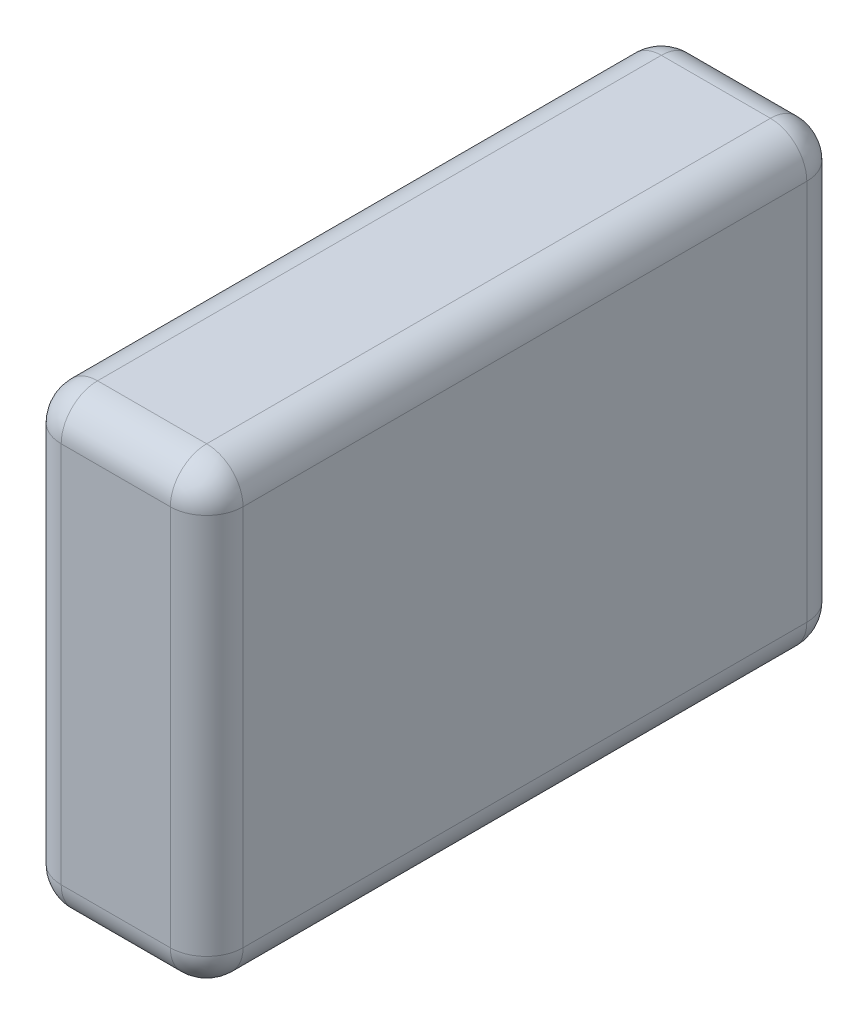
ISO-10303-21;
HEADER;
FILE_DESCRIPTION(('STEP AP214'),'2;1');
FILE_NAME('part.step','',(''),(''),'','','');
FILE_SCHEMA(('AUTOMOTIVE_DESIGN { 1 0 10303 214 1 1 1 1 }'));
ENDSEC;
DATA;
#1=APPLICATION_CONTEXT('core data for automotive mechanical design processes');
#2=APPLICATION_PROTOCOL_DEFINITION('international standard','automotive_design',2000,#1);
#3=PRODUCT_CONTEXT('',#1,'mechanical');
#4=PRODUCT('Part','Part','',(#3));
#5=PRODUCT_RELATED_PRODUCT_CATEGORY('part','',(#4));
#6=PRODUCT_DEFINITION_FORMATION('','',#4);
#7=PRODUCT_DEFINITION_CONTEXT('part definition',#1,'design');
#8=PRODUCT_DEFINITION('design','',#6,#7);
#9=PRODUCT_DEFINITION_SHAPE('','',#8);
#10=(LENGTH_UNIT() NAMED_UNIT(*) SI_UNIT(.MILLI.,.METRE.));
#11=(NAMED_UNIT(*) PLANE_ANGLE_UNIT() SI_UNIT($,.RADIAN.));
#12=(NAMED_UNIT(*) SI_UNIT($,.STERADIAN.) SOLID_ANGLE_UNIT());
#13=UNCERTAINTY_MEASURE_WITH_UNIT(LENGTH_MEASURE(1.E-05),#10,'distance_accuracy_value','');
#14=(GEOMETRIC_REPRESENTATION_CONTEXT(3) GLOBAL_UNCERTAINTY_ASSIGNED_CONTEXT((#13)) GLOBAL_UNIT_ASSIGNED_CONTEXT((#10,
#11,#12)) REPRESENTATION_CONTEXT('',''));
#15=CARTESIAN_POINT('',(0.,0.,0.));
#16=DIRECTION('',(0.,0.,1.));
#17=DIRECTION('',(1.,0.,0.));
#18=AXIS2_PLACEMENT_3D('',#15,#16,#17);
#19=CARTESIAN_POINT('',(20.,0.,0.));
#20=DIRECTION('',(0.,0.,-1.));
#21=DIRECTION('',(0.,1.,0.));
#22=AXIS2_PLACEMENT_3D('',#19,#20,#21);
#23=PLANE('',#22);
#24=DIRECTION('',(0.,-1.,0.));
#25=VECTOR('',#24,1.);
#26=CARTESIAN_POINT('',(16.,0.,0.));
#27=LINE('',#26,#25);
#28=CARTESIAN_POINT('',(16.,-46.,0.));
#29=VERTEX_POINT('',#28);
#30=CARTESIAN_POINT('',(16.,-4.,0.));
#31=VERTEX_POINT('',#30);
#32=EDGE_CURVE('E237',#29,#31,#27,.F.);
#33=ORIENTED_EDGE('',*,*,#32,.T.);
#34=DIRECTION('',(-1.,0.,0.));
#35=VECTOR('',#34,1.);
#36=CARTESIAN_POINT('',(20.,-4.,0.));
#37=LINE('',#36,#35);
#38=CARTESIAN_POINT('',(4.,-4.,0.));
#39=VERTEX_POINT('',#38);
#40=EDGE_CURVE('E183',#31,#39,#37,.T.);
#41=ORIENTED_EDGE('',*,*,#40,.T.);
#42=DIRECTION('',(0.,-1.,0.));
#43=VECTOR('',#42,1.);
#44=CARTESIAN_POINT('',(4.,0.,0.));
#45=LINE('',#44,#43);
#46=CARTESIAN_POINT('',(4.,-46.,0.));
#47=VERTEX_POINT('',#46);
#48=EDGE_CURVE('E291',#39,#47,#45,.T.);
#49=ORIENTED_EDGE('',*,*,#48,.T.);
#50=DIRECTION('',(-1.,0.,0.));
#51=VECTOR('',#50,1.);
#52=CARTESIAN_POINT('',(20.,-46.,0.));
#53=LINE('',#52,#51);
#54=EDGE_CURVE('E181',#47,#29,#53,.F.);
#55=ORIENTED_EDGE('',*,*,#54,.T.);
#56=EDGE_LOOP('',(#33,#41,#49,#55));
#57=FACE_BOUND('',#56,.T.);
#58=ADVANCED_FACE('F36',(#57),#23,.F.);
#59=CARTESIAN_POINT('',(20.,-50.,0.));
#60=DIRECTION('',(0.,1.,0.));
#61=DIRECTION('',(0.,0.,1.));
#62=AXIS2_PLACEMENT_3D('',#59,#60,#61);
#63=PLANE('',#62);
#64=DIRECTION('',(0.,0.,-1.));
#65=VECTOR('',#64,1.);
#66=CARTESIAN_POINT('',(16.,-50.,0.));
#67=LINE('',#66,#65);
#68=CARTESIAN_POINT('',(16.,-50.,-66.));
#69=VERTEX_POINT('',#68);
#70=CARTESIAN_POINT('',(16.,-50.,-4.00000000000001));
#71=VERTEX_POINT('',#70);
#72=EDGE_CURVE('E262',#69,#71,#67,.F.);
#73=ORIENTED_EDGE('',*,*,#72,.T.);
#74=DIRECTION('',(-1.,0.,0.));
#75=VECTOR('',#74,1.);
#76=CARTESIAN_POINT('',(20.,-50.,-4.00000000000001));
#77=LINE('',#76,#75);
#78=CARTESIAN_POINT('',(4.,-50.,-4.00000000000001));
#79=VERTEX_POINT('',#78);
#80=EDGE_CURVE('E11',#71,#79,#77,.T.);
#81=ORIENTED_EDGE('',*,*,#80,.T.);
#82=DIRECTION('',(0.,0.,-1.));
#83=VECTOR('',#82,1.);
#84=CARTESIAN_POINT('',(4.,-50.,0.));
#85=LINE('',#84,#83);
#86=CARTESIAN_POINT('',(4.,-50.,-66.));
#87=VERTEX_POINT('',#86);
#88=EDGE_CURVE('E130',#79,#87,#85,.T.);
#89=ORIENTED_EDGE('',*,*,#88,.T.);
#90=DIRECTION('',(-1.,0.,0.));
#91=VECTOR('',#90,1.);
#92=CARTESIAN_POINT('',(20.,-50.,-66.));
#93=LINE('',#92,#91);
#94=EDGE_CURVE('E45',#87,#69,#93,.F.);
#95=ORIENTED_EDGE('',*,*,#94,.T.);
#96=EDGE_LOOP('',(#73,#81,#89,#95));
#97=FACE_BOUND('',#96,.T.);
#98=ADVANCED_FACE('F334',(#97),#63,.F.);
#99=CARTESIAN_POINT('',(20.,0.,-70.));
#100=DIRECTION('',(0.,0.,1.));
#101=DIRECTION('',(1.,0.,0.));
#102=AXIS2_PLACEMENT_3D('',#99,#100,#101);
#103=PLANE('',#102);
#104=DIRECTION('',(0.,1.,0.));
#105=VECTOR('',#104,1.);
#106=CARTESIAN_POINT('',(4.,0.,-70.));
#107=LINE('',#106,#105);
#108=CARTESIAN_POINT('',(4.,-46.,-70.));
#109=VERTEX_POINT('',#108);
#110=CARTESIAN_POINT('',(4.,-4.,-70.));
#111=VERTEX_POINT('',#110);
#112=EDGE_CURVE('E155',#109,#111,#107,.T.);
#113=ORIENTED_EDGE('',*,*,#112,.T.);
#114=DIRECTION('',(-1.,0.,0.));
#115=VECTOR('',#114,1.);
#116=CARTESIAN_POINT('',(20.,-4.,-70.));
#117=LINE('',#116,#115);
#118=CARTESIAN_POINT('',(16.,-4.,-70.));
#119=VERTEX_POINT('',#118);
#120=EDGE_CURVE('E179',#111,#119,#117,.F.);
#121=ORIENTED_EDGE('',*,*,#120,.T.);
#122=DIRECTION('',(0.,1.,0.));
#123=VECTOR('',#122,1.);
#124=CARTESIAN_POINT('',(16.,-50.,-70.));
#125=LINE('',#124,#123);
#126=CARTESIAN_POINT('',(16.,-46.,-70.));
#127=VERTEX_POINT('',#126);
#128=EDGE_CURVE('E259',#119,#127,#125,.F.);
#129=ORIENTED_EDGE('',*,*,#128,.T.);
#130=DIRECTION('',(-1.,0.,0.));
#131=VECTOR('',#130,1.);
#132=CARTESIAN_POINT('',(20.,-46.,-70.));
#133=LINE('',#132,#131);
#134=EDGE_CURVE('E177',#127,#109,#133,.T.);
#135=ORIENTED_EDGE('',*,*,#134,.T.);
#136=EDGE_LOOP('',(#113,#121,#129,#135));
#137=FACE_BOUND('',#136,.T.);
#138=ADVANCED_FACE('F277',(#137),#103,.F.);
#139=CARTESIAN_POINT('',(20.,0.,0.));
#140=DIRECTION('',(0.,-1.,0.));
#141=DIRECTION('',(0.,0.,-1.));
#142=AXIS2_PLACEMENT_3D('',#139,#140,#141);
#143=PLANE('',#142);
#144=DIRECTION('',(0.,0.,1.));
#145=VECTOR('',#144,1.);
#146=CARTESIAN_POINT('',(16.,0.,-70.));
#147=LINE('',#146,#145);
#148=CARTESIAN_POINT('',(16.,0.,-4.));
#149=VERTEX_POINT('',#148);
#150=CARTESIAN_POINT('',(16.,0.,-66.));
#151=VERTEX_POINT('',#150);
#152=EDGE_CURVE('E264',#149,#151,#147,.F.);
#153=ORIENTED_EDGE('',*,*,#152,.T.);
#154=DIRECTION('',(-1.,0.,0.));
#155=VECTOR('',#154,1.);
#156=CARTESIAN_POINT('',(20.,0.,-66.));
#157=LINE('',#156,#155);
#158=CARTESIAN_POINT('',(4.,0.,-66.));
#159=VERTEX_POINT('',#158);
#160=EDGE_CURVE('E175',#151,#159,#157,.T.);
#161=ORIENTED_EDGE('',*,*,#160,.T.);
#162=DIRECTION('',(0.,0.,1.));
#163=VECTOR('',#162,1.);
#164=CARTESIAN_POINT('',(4.,0.,0.));
#165=LINE('',#164,#163);
#166=CARTESIAN_POINT('',(4.,0.,-4.));
#167=VERTEX_POINT('',#166);
#168=EDGE_CURVE('E292',#159,#167,#165,.T.);
#169=ORIENTED_EDGE('',*,*,#168,.T.);
#170=DIRECTION('',(-1.,0.,0.));
#171=VECTOR('',#170,1.);
#172=CARTESIAN_POINT('',(20.,0.,-4.));
#173=LINE('',#172,#171);
#174=EDGE_CURVE('E135',#167,#149,#173,.F.);
#175=ORIENTED_EDGE('',*,*,#174,.T.);
#176=EDGE_LOOP('',(#153,#161,#169,#175));
#177=FACE_BOUND('',#176,.T.);
#178=ADVANCED_FACE('F311',(#177),#143,.F.);
#179=CARTESIAN_POINT('',(20.,0.,0.));
#180=DIRECTION('',(1.,0.,0.));
#181=DIRECTION('',(0.,0.,-1.));
#182=AXIS2_PLACEMENT_3D('',#179,#180,#181);
#183=PLANE('',#182);
#184=DIRECTION('',(0.,-1.,0.));
#185=VECTOR('',#184,1.);
#186=CARTESIAN_POINT('',(20.,-50.,-4.00000000000001));
#187=LINE('',#186,#185);
#188=CARTESIAN_POINT('',(20.,-4.,-4.));
#189=VERTEX_POINT('',#188);
#190=CARTESIAN_POINT('',(20.,-46.,-4.00000000000001));
#191=VERTEX_POINT('',#190);
#192=EDGE_CURVE('E234',#189,#191,#187,.T.);
#193=ORIENTED_EDGE('',*,*,#192,.T.);
#194=DIRECTION('',(0.,0.,-1.));
#195=VECTOR('',#194,1.);
#196=CARTESIAN_POINT('',(20.,-46.,-70.));
#197=LINE('',#196,#195);
#198=CARTESIAN_POINT('',(20.,-46.,-66.));
#199=VERTEX_POINT('',#198);
#200=EDGE_CURVE('E242',#191,#199,#197,.T.);
#201=ORIENTED_EDGE('',*,*,#200,.T.);
#202=DIRECTION('',(0.,1.,0.));
#203=VECTOR('',#202,1.);
#204=CARTESIAN_POINT('',(20.,0.,-66.));
#205=LINE('',#204,#203);
#206=CARTESIAN_POINT('',(20.,-4.,-66.));
#207=VERTEX_POINT('',#206);
#208=EDGE_CURVE('E253',#199,#207,#205,.T.);
#209=ORIENTED_EDGE('',*,*,#208,.T.);
#210=DIRECTION('',(0.,0.,1.));
#211=VECTOR('',#210,1.);
#212=CARTESIAN_POINT('',(20.,-4.,0.));
#213=LINE('',#212,#211);
#214=EDGE_CURVE('E252',#207,#189,#213,.T.);
#215=ORIENTED_EDGE('',*,*,#214,.T.);
#216=EDGE_LOOP('',(#193,#201,#209,#215));
#217=FACE_BOUND('',#216,.T.);
#218=ADVANCED_FACE('F250',(#217),#183,.T.);
#219=CARTESIAN_POINT('',(0.,0.,0.));
#220=DIRECTION('',(1.,0.,0.));
#221=DIRECTION('',(0.,0.,-1.));
#222=AXIS2_PLACEMENT_3D('',#219,#220,#221);
#223=PLANE('',#222);
#224=DIRECTION('',(0.,0.,1.));
#225=VECTOR('',#224,1.);
#226=CARTESIAN_POINT('',(0.,-4.,0.));
#227=LINE('',#226,#225);
#228=CARTESIAN_POINT('',(0.,-4.,-4.));
#229=VERTEX_POINT('',#228);
#230=CARTESIAN_POINT('',(0.,-4.,-66.));
#231=VERTEX_POINT('',#230);
#232=EDGE_CURVE('E146',#229,#231,#227,.F.);
#233=ORIENTED_EDGE('',*,*,#232,.T.);
#234=DIRECTION('',(0.,1.,0.));
#235=VECTOR('',#234,1.);
#236=CARTESIAN_POINT('',(0.,0.,-66.));
#237=LINE('',#236,#235);
#238=CARTESIAN_POINT('',(0.,-46.,-66.));
#239=VERTEX_POINT('',#238);
#240=EDGE_CURVE('E145',#231,#239,#237,.F.);
#241=ORIENTED_EDGE('',*,*,#240,.T.);
#242=DIRECTION('',(0.,0.,-1.));
#243=VECTOR('',#242,1.);
#244=CARTESIAN_POINT('',(0.,-46.,0.));
#245=LINE('',#244,#243);
#246=CARTESIAN_POINT('',(0.,-46.,-4.00000000000001));
#247=VERTEX_POINT('',#246);
#248=EDGE_CURVE('E128',#239,#247,#245,.F.);
#249=ORIENTED_EDGE('',*,*,#248,.T.);
#250=DIRECTION('',(0.,-1.,0.));
#251=VECTOR('',#250,1.);
#252=CARTESIAN_POINT('',(0.,0.,-4.));
#253=LINE('',#252,#251);
#254=EDGE_CURVE('E142',#247,#229,#253,.F.);
#255=ORIENTED_EDGE('',*,*,#254,.T.);
#256=EDGE_LOOP('',(#233,#241,#249,#255));
#257=FACE_BOUND('',#256,.T.);
#258=ADVANCED_FACE('F141',(#257),#223,.F.);
#259=CARTESIAN_POINT('',(4.,0.,-4.));
#260=DIRECTION('',(0.,-1.,0.));
#261=DIRECTION('',(0.,0.,-1.));
#262=AXIS2_PLACEMENT_3D('',#259,#260,#261);
#263=CYLINDRICAL_SURFACE('',#262,4.);
#264=ORIENTED_EDGE('',*,*,#48,.F.);
#265=CARTESIAN_POINT('',(4.,-4.,-4.));
#266=DIRECTION('',(0.,-1.,0.));
#267=DIRECTION('',(0.,0.,-1.));
#268=AXIS2_PLACEMENT_3D('',#265,#266,#267);
#269=CIRCLE('',#268,4.);
#270=EDGE_CURVE('E154',#39,#229,#269,.T.);
#271=ORIENTED_EDGE('',*,*,#270,.T.);
#272=ORIENTED_EDGE('',*,*,#254,.F.);
#273=CARTESIAN_POINT('',(4.,-46.,-4.00000000000001));
#274=DIRECTION('',(0.,-1.,0.));
#275=DIRECTION('',(0.,0.,-1.));
#276=AXIS2_PLACEMENT_3D('',#273,#274,#275);
#277=CIRCLE('',#276,4.);
#278=EDGE_CURVE('E151',#247,#47,#277,.F.);
#279=ORIENTED_EDGE('',*,*,#278,.T.);
#280=EDGE_LOOP('',(#264,#271,#272,#279));
#281=FACE_BOUND('',#280,.T.);
#282=ADVANCED_FACE('F150',(#281),#263,.T.);
#283=CARTESIAN_POINT('',(4.,-46.,0.));
#284=DIRECTION('',(0.,0.,-1.));
#285=DIRECTION('',(-1.,0.,0.));
#286=AXIS2_PLACEMENT_3D('',#283,#284,#285);
#287=CYLINDRICAL_SURFACE('',#286,4.);
#288=ORIENTED_EDGE('',*,*,#88,.F.);
#289=CARTESIAN_POINT('',(4.,-46.,-4.00000000000001));
#290=DIRECTION('',(0.,0.,-1.));
#291=DIRECTION('',(-1.,0.,0.));
#292=AXIS2_PLACEMENT_3D('',#289,#290,#291);
#293=CIRCLE('',#292,4.);
#294=EDGE_CURVE('E125',#79,#247,#293,.T.);
#295=ORIENTED_EDGE('',*,*,#294,.T.);
#296=ORIENTED_EDGE('',*,*,#248,.F.);
#297=CARTESIAN_POINT('',(4.,-46.,-66.));
#298=DIRECTION('',(0.,0.,-1.));
#299=DIRECTION('',(-1.,0.,0.));
#300=AXIS2_PLACEMENT_3D('',#297,#298,#299);
#301=CIRCLE('',#300,4.);
#302=EDGE_CURVE('E53',#239,#87,#301,.F.);
#303=ORIENTED_EDGE('',*,*,#302,.T.);
#304=EDGE_LOOP('',(#288,#295,#296,#303));
#305=FACE_BOUND('',#304,.T.);
#306=ADVANCED_FACE('F127',(#305),#287,.T.);
#307=CARTESIAN_POINT('',(4.,-4.,0.));
#308=DIRECTION('',(0.,0.,1.));
#309=DIRECTION('',(1.,0.,0.));
#310=AXIS2_PLACEMENT_3D('',#307,#308,#309);
#311=CYLINDRICAL_SURFACE('',#310,4.);
#312=ORIENTED_EDGE('',*,*,#168,.F.);
#313=CARTESIAN_POINT('',(4.,-4.,-66.));
#314=DIRECTION('',(0.,0.,1.));
#315=DIRECTION('',(1.,0.,0.));
#316=AXIS2_PLACEMENT_3D('',#313,#314,#315);
#317=CIRCLE('',#316,4.);
#318=EDGE_CURVE('E225',#159,#231,#317,.T.);
#319=ORIENTED_EDGE('',*,*,#318,.T.);
#320=ORIENTED_EDGE('',*,*,#232,.F.);
#321=CARTESIAN_POINT('',(4.,-4.,-4.));
#322=DIRECTION('',(0.,0.,1.));
#323=DIRECTION('',(1.,0.,0.));
#324=AXIS2_PLACEMENT_3D('',#321,#322,#323);
#325=CIRCLE('',#324,4.);
#326=EDGE_CURVE('E218',#229,#167,#325,.F.);
#327=ORIENTED_EDGE('',*,*,#326,.T.);
#328=EDGE_LOOP('',(#312,#319,#320,#327));
#329=FACE_BOUND('',#328,.T.);
#330=ADVANCED_FACE('F308',(#329),#311,.T.);
#331=CARTESIAN_POINT('',(4.,0.,-66.));
#332=DIRECTION('',(0.,1.,0.));
#333=DIRECTION('',(0.,0.,1.));
#334=AXIS2_PLACEMENT_3D('',#331,#332,#333);
#335=CYLINDRICAL_SURFACE('',#334,4.);
#336=ORIENTED_EDGE('',*,*,#240,.F.);
#337=CARTESIAN_POINT('',(4.,-4.,-66.));
#338=DIRECTION('',(0.,1.,0.));
#339=DIRECTION('',(0.,0.,1.));
#340=AXIS2_PLACEMENT_3D('',#337,#338,#339);
#341=CIRCLE('',#340,4.);
#342=EDGE_CURVE('E215',#231,#111,#341,.F.);
#343=ORIENTED_EDGE('',*,*,#342,.T.);
#344=ORIENTED_EDGE('',*,*,#112,.F.);
#345=CARTESIAN_POINT('',(4.,-46.,-66.));
#346=DIRECTION('',(0.,1.,0.));
#347=DIRECTION('',(0.,0.,1.));
#348=AXIS2_PLACEMENT_3D('',#345,#346,#347);
#349=CIRCLE('',#348,4.);
#350=EDGE_CURVE('E212',#109,#239,#349,.T.);
#351=ORIENTED_EDGE('',*,*,#350,.T.);
#352=EDGE_LOOP('',(#336,#343,#344,#351));
#353=FACE_BOUND('',#352,.T.);
#354=ADVANCED_FACE('F303',(#353),#335,.T.);
#355=CARTESIAN_POINT('',(16.,0.,-66.));
#356=DIRECTION('',(0.,-1.,0.));
#357=DIRECTION('',(0.,0.,-1.));
#358=AXIS2_PLACEMENT_3D('',#355,#356,#357);
#359=CYLINDRICAL_SURFACE('',#358,4.);
#360=ORIENTED_EDGE('',*,*,#128,.F.);
#361=CARTESIAN_POINT('',(16.,-4.,-66.));
#362=DIRECTION('',(0.,-1.,0.));
#363=DIRECTION('',(0.,0.,-1.));
#364=AXIS2_PLACEMENT_3D('',#361,#362,#363);
#365=CIRCLE('',#364,4.);
#366=EDGE_CURVE('E216',#119,#207,#365,.T.);
#367=ORIENTED_EDGE('',*,*,#366,.T.);
#368=ORIENTED_EDGE('',*,*,#208,.F.);
#369=CARTESIAN_POINT('',(16.,-46.,-66.));
#370=DIRECTION('',(0.,-1.,0.));
#371=DIRECTION('',(0.,0.,-1.));
#372=AXIS2_PLACEMENT_3D('',#369,#370,#371);
#373=CIRCLE('',#372,4.);
#374=EDGE_CURVE('E220',#199,#127,#373,.F.);
#375=ORIENTED_EDGE('',*,*,#374,.T.);
#376=EDGE_LOOP('',(#360,#367,#368,#375));
#377=FACE_BOUND('',#376,.T.);
#378=ADVANCED_FACE('F273',(#377),#359,.T.);
#379=CARTESIAN_POINT('',(16.,-4.,0.));
#380=DIRECTION('',(0.,0.,-1.));
#381=DIRECTION('',(-1.,0.,0.));
#382=AXIS2_PLACEMENT_3D('',#379,#380,#381);
#383=CYLINDRICAL_SURFACE('',#382,4.);
#384=ORIENTED_EDGE('',*,*,#214,.F.);
#385=CARTESIAN_POINT('',(16.,-4.,-66.));
#386=DIRECTION('',(0.,0.,-1.));
#387=DIRECTION('',(-1.,0.,0.));
#388=AXIS2_PLACEMENT_3D('',#385,#386,#387);
#389=CIRCLE('',#388,4.);
#390=EDGE_CURVE('E269',#207,#151,#389,.F.);
#391=ORIENTED_EDGE('',*,*,#390,.T.);
#392=ORIENTED_EDGE('',*,*,#152,.F.);
#393=CARTESIAN_POINT('',(16.,-4.,-4.));
#394=DIRECTION('',(0.,0.,-1.));
#395=DIRECTION('',(-1.,0.,0.));
#396=AXIS2_PLACEMENT_3D('',#393,#394,#395);
#397=CIRCLE('',#396,4.);
#398=EDGE_CURVE('E267',#149,#189,#397,.T.);
#399=ORIENTED_EDGE('',*,*,#398,.T.);
#400=EDGE_LOOP('',(#384,#391,#392,#399));
#401=FACE_BOUND('',#400,.T.);
#402=ADVANCED_FACE('F288',(#401),#383,.T.);
#403=CARTESIAN_POINT('',(16.,-46.,0.));
#404=DIRECTION('',(0.,0.,1.));
#405=DIRECTION('',(1.,0.,0.));
#406=AXIS2_PLACEMENT_3D('',#403,#404,#405);
#407=CYLINDRICAL_SURFACE('',#406,4.);
#408=ORIENTED_EDGE('',*,*,#200,.F.);
#409=CARTESIAN_POINT('',(16.,-46.,-4.00000000000001));
#410=DIRECTION('',(0.,0.,1.));
#411=DIRECTION('',(1.,0.,0.));
#412=AXIS2_PLACEMENT_3D('',#409,#410,#411);
#413=CIRCLE('',#412,4.);
#414=EDGE_CURVE('E171',#191,#71,#413,.F.);
#415=ORIENTED_EDGE('',*,*,#414,.T.);
#416=ORIENTED_EDGE('',*,*,#72,.F.);
#417=CARTESIAN_POINT('',(16.,-46.,-66.));
#418=DIRECTION('',(0.,0.,1.));
#419=DIRECTION('',(1.,0.,0.));
#420=AXIS2_PLACEMENT_3D('',#417,#418,#419);
#421=CIRCLE('',#420,4.);
#422=EDGE_CURVE('E162',#69,#199,#421,.T.);
#423=ORIENTED_EDGE('',*,*,#422,.T.);
#424=EDGE_LOOP('',(#408,#415,#416,#423));
#425=FACE_BOUND('',#424,.T.);
#426=ADVANCED_FACE('F243',(#425),#407,.T.);
#427=CARTESIAN_POINT('',(16.,0.,-4.));
#428=DIRECTION('',(0.,1.,0.));
#429=DIRECTION('',(0.,0.,1.));
#430=AXIS2_PLACEMENT_3D('',#427,#428,#429);
#431=CYLINDRICAL_SURFACE('',#430,4.);
#432=ORIENTED_EDGE('',*,*,#192,.F.);
#433=CARTESIAN_POINT('',(16.,-4.,-4.));
#434=DIRECTION('',(0.,1.,0.));
#435=DIRECTION('',(0.,0.,1.));
#436=AXIS2_PLACEMENT_3D('',#433,#434,#435);
#437=CIRCLE('',#436,4.);
#438=EDGE_CURVE('E160',#189,#31,#437,.F.);
#439=ORIENTED_EDGE('',*,*,#438,.T.);
#440=ORIENTED_EDGE('',*,*,#32,.F.);
#441=CARTESIAN_POINT('',(16.,-46.,-4.00000000000001));
#442=DIRECTION('',(0.,1.,0.));
#443=DIRECTION('',(0.,0.,1.));
#444=AXIS2_PLACEMENT_3D('',#441,#442,#443);
#445=CIRCLE('',#444,4.);
#446=EDGE_CURVE('E165',#29,#191,#445,.T.);
#447=ORIENTED_EDGE('',*,*,#446,.T.);
#448=EDGE_LOOP('',(#432,#439,#440,#447));
#449=FACE_BOUND('',#448,.T.);
#450=ADVANCED_FACE('F232',(#449),#431,.T.);
#451=CARTESIAN_POINT('',(4.,-4.,-66.));
#452=DIRECTION('',(0.,0.,1.));
#453=DIRECTION('',(1.,0.,0.));
#454=AXIS2_PLACEMENT_3D('',#451,#452,#453);
#455=SPHERICAL_SURFACE('',#454,4.);
#456=ORIENTED_EDGE('',*,*,#342,.F.);
#457=ORIENTED_EDGE('',*,*,#318,.F.);
#458=CARTESIAN_POINT('',(4.,-4.,-66.));
#459=DIRECTION('',(1.,0.,0.));
#460=DIRECTION('',(0.,0.,-1.));
#461=AXIS2_PLACEMENT_3D('',#458,#459,#460);
#462=CIRCLE('',#461,4.);
#463=EDGE_CURVE('E188',#111,#159,#462,.T.);
#464=ORIENTED_EDGE('',*,*,#463,.F.);
#465=EDGE_LOOP('',(#456,#457,#464));
#466=FACE_BOUND('',#465,.T.);
#467=ADVANCED_FACE('F306',(#466),#455,.T.);
#468=CARTESIAN_POINT('',(20.,-4.,-66.));
#469=DIRECTION('',(-1.,0.,0.));
#470=DIRECTION('',(0.,0.,1.));
#471=AXIS2_PLACEMENT_3D('',#468,#469,#470);
#472=CYLINDRICAL_SURFACE('',#471,4.);
#473=ORIENTED_EDGE('',*,*,#463,.T.);
#474=ORIENTED_EDGE('',*,*,#160,.F.);
#475=CARTESIAN_POINT('',(16.,-4.,-66.));
#476=DIRECTION('',(1.,0.,0.));
#477=DIRECTION('',(0.,0.,-1.));
#478=AXIS2_PLACEMENT_3D('',#475,#476,#477);
#479=CIRCLE('',#478,4.);
#480=EDGE_CURVE('E186',#119,#151,#479,.T.);
#481=ORIENTED_EDGE('',*,*,#480,.F.);
#482=ORIENTED_EDGE('',*,*,#120,.F.);
#483=EDGE_LOOP('',(#473,#474,#481,#482));
#484=FACE_BOUND('',#483,.T.);
#485=ADVANCED_FACE('F282',(#484),#472,.T.);
#486=CARTESIAN_POINT('',(16.,-4.,-66.));
#487=DIRECTION('',(0.,0.,1.));
#488=DIRECTION('',(1.,0.,0.));
#489=AXIS2_PLACEMENT_3D('',#486,#487,#488);
#490=SPHERICAL_SURFACE('',#489,4.);
#491=ORIENTED_EDGE('',*,*,#390,.F.);
#492=ORIENTED_EDGE('',*,*,#366,.F.);
#493=ORIENTED_EDGE('',*,*,#480,.T.);
#494=EDGE_LOOP('',(#491,#492,#493));
#495=FACE_BOUND('',#494,.T.);
#496=ADVANCED_FACE('F286',(#495),#490,.T.);
#497=CARTESIAN_POINT('',(4.,-4.,-4.));
#498=DIRECTION('',(0.,0.,1.));
#499=DIRECTION('',(1.,0.,0.));
#500=AXIS2_PLACEMENT_3D('',#497,#498,#499);
#501=SPHERICAL_SURFACE('',#500,4.);
#502=ORIENTED_EDGE('',*,*,#326,.F.);
#503=ORIENTED_EDGE('',*,*,#270,.F.);
#504=CARTESIAN_POINT('',(4.,-4.,-4.));
#505=DIRECTION('',(1.,0.,0.));
#506=DIRECTION('',(0.,0.,-1.));
#507=AXIS2_PLACEMENT_3D('',#504,#505,#506);
#508=CIRCLE('',#507,4.);
#509=EDGE_CURVE('E189',#167,#39,#508,.T.);
#510=ORIENTED_EDGE('',*,*,#509,.F.);
#511=EDGE_LOOP('',(#502,#503,#510));
#512=FACE_BOUND('',#511,.T.);
#513=ADVANCED_FACE('F314',(#512),#501,.T.);
#514=CARTESIAN_POINT('',(20.,-4.,-4.));
#515=DIRECTION('',(-1.,0.,0.));
#516=DIRECTION('',(0.,0.,1.));
#517=AXIS2_PLACEMENT_3D('',#514,#515,#516);
#518=CYLINDRICAL_SURFACE('',#517,4.);
#519=ORIENTED_EDGE('',*,*,#509,.T.);
#520=ORIENTED_EDGE('',*,*,#40,.F.);
#521=CARTESIAN_POINT('',(16.,-4.,-4.));
#522=DIRECTION('',(1.,0.,0.));
#523=DIRECTION('',(0.,0.,-1.));
#524=AXIS2_PLACEMENT_3D('',#521,#522,#523);
#525=CIRCLE('',#524,4.);
#526=EDGE_CURVE('E192',#149,#31,#525,.T.);
#527=ORIENTED_EDGE('',*,*,#526,.F.);
#528=ORIENTED_EDGE('',*,*,#174,.F.);
#529=EDGE_LOOP('',(#519,#520,#527,#528));
#530=FACE_BOUND('',#529,.T.);
#531=ADVANCED_FACE('F318',(#530),#518,.T.);
#532=CARTESIAN_POINT('',(16.,-4.,-4.));
#533=DIRECTION('',(0.,0.,1.));
#534=DIRECTION('',(1.,0.,0.));
#535=AXIS2_PLACEMENT_3D('',#532,#533,#534);
#536=SPHERICAL_SURFACE('',#535,4.);
#537=ORIENTED_EDGE('',*,*,#438,.F.);
#538=ORIENTED_EDGE('',*,*,#398,.F.);
#539=ORIENTED_EDGE('',*,*,#526,.T.);
#540=EDGE_LOOP('',(#537,#538,#539));
#541=FACE_BOUND('',#540,.T.);
#542=ADVANCED_FACE('F320',(#541),#536,.T.);
#543=CARTESIAN_POINT('',(4.,-46.,-4.00000000000001));
#544=DIRECTION('',(0.,0.,1.));
#545=DIRECTION('',(1.,0.,0.));
#546=AXIS2_PLACEMENT_3D('',#543,#544,#545);
#547=SPHERICAL_SURFACE('',#546,4.);
#548=ORIENTED_EDGE('',*,*,#278,.F.);
#549=ORIENTED_EDGE('',*,*,#294,.F.);
#550=CARTESIAN_POINT('',(4.,-46.,-4.00000000000001));
#551=DIRECTION('',(1.,0.,0.));
#552=DIRECTION('',(0.,0.,-1.));
#553=AXIS2_PLACEMENT_3D('',#550,#551,#552);
#554=CIRCLE('',#553,4.);
#555=EDGE_CURVE('E158',#47,#79,#554,.T.);
#556=ORIENTED_EDGE('',*,*,#555,.F.);
#557=EDGE_LOOP('',(#548,#549,#556));
#558=FACE_BOUND('',#557,.T.);
#559=ADVANCED_FACE('F157',(#558),#547,.T.);
#560=CARTESIAN_POINT('',(20.,-46.,-4.00000000000001));
#561=DIRECTION('',(-1.,0.,0.));
#562=DIRECTION('',(0.,0.,1.));
#563=AXIS2_PLACEMENT_3D('',#560,#561,#562);
#564=CYLINDRICAL_SURFACE('',#563,4.);
#565=ORIENTED_EDGE('',*,*,#555,.T.);
#566=ORIENTED_EDGE('',*,*,#80,.F.);
#567=CARTESIAN_POINT('',(16.,-46.,-4.00000000000001));
#568=DIRECTION('',(1.,0.,0.));
#569=DIRECTION('',(0.,0.,-1.));
#570=AXIS2_PLACEMENT_3D('',#567,#568,#569);
#571=CIRCLE('',#570,4.);
#572=EDGE_CURVE('E196',#29,#71,#571,.T.);
#573=ORIENTED_EDGE('',*,*,#572,.F.);
#574=ORIENTED_EDGE('',*,*,#54,.F.);
#575=EDGE_LOOP('',(#565,#566,#573,#574));
#576=FACE_BOUND('',#575,.T.);
#577=ADVANCED_FACE('F323',(#576),#564,.T.);
#578=CARTESIAN_POINT('',(16.,-46.,-4.00000000000001));
#579=DIRECTION('',(0.,0.,1.));
#580=DIRECTION('',(1.,0.,0.));
#581=AXIS2_PLACEMENT_3D('',#578,#579,#580);
#582=SPHERICAL_SURFACE('',#581,4.);
#583=ORIENTED_EDGE('',*,*,#572,.T.);
#584=ORIENTED_EDGE('',*,*,#414,.F.);
#585=ORIENTED_EDGE('',*,*,#446,.F.);
#586=EDGE_LOOP('',(#583,#584,#585));
#587=FACE_BOUND('',#586,.T.);
#588=ADVANCED_FACE('F324',(#587),#582,.T.);
#589=CARTESIAN_POINT('',(4.,-46.,-66.));
#590=DIRECTION('',(0.,0.,1.));
#591=DIRECTION('',(1.,0.,0.));
#592=AXIS2_PLACEMENT_3D('',#589,#590,#591);
#593=SPHERICAL_SURFACE('',#592,4.);
#594=ORIENTED_EDGE('',*,*,#302,.F.);
#595=ORIENTED_EDGE('',*,*,#350,.F.);
#596=CARTESIAN_POINT('',(4.,-46.,-66.));
#597=DIRECTION('',(1.,0.,0.));
#598=DIRECTION('',(0.,0.,-1.));
#599=AXIS2_PLACEMENT_3D('',#596,#597,#598);
#600=CIRCLE('',#599,4.);
#601=EDGE_CURVE('E40',#87,#109,#600,.T.);
#602=ORIENTED_EDGE('',*,*,#601,.F.);
#603=EDGE_LOOP('',(#594,#595,#602));
#604=FACE_BOUND('',#603,.T.);
#605=ADVANCED_FACE('F38',(#604),#593,.T.);
#606=CARTESIAN_POINT('',(20.,-46.,-66.));
#607=DIRECTION('',(-1.,0.,0.));
#608=DIRECTION('',(0.,0.,1.));
#609=AXIS2_PLACEMENT_3D('',#606,#607,#608);
#610=CYLINDRICAL_SURFACE('',#609,4.);
#611=ORIENTED_EDGE('',*,*,#601,.T.);
#612=ORIENTED_EDGE('',*,*,#134,.F.);
#613=CARTESIAN_POINT('',(16.,-46.,-66.));
#614=DIRECTION('',(1.,0.,0.));
#615=DIRECTION('',(0.,0.,-1.));
#616=AXIS2_PLACEMENT_3D('',#613,#614,#615);
#617=CIRCLE('',#616,4.);
#618=EDGE_CURVE('E199',#69,#127,#617,.T.);
#619=ORIENTED_EDGE('',*,*,#618,.F.);
#620=ORIENTED_EDGE('',*,*,#94,.F.);
#621=EDGE_LOOP('',(#611,#612,#619,#620));
#622=FACE_BOUND('',#621,.T.);
#623=ADVANCED_FACE('F209',(#622),#610,.T.);
#624=CARTESIAN_POINT('',(16.,-46.,-66.));
#625=DIRECTION('',(0.,0.,1.));
#626=DIRECTION('',(1.,0.,0.));
#627=AXIS2_PLACEMENT_3D('',#624,#625,#626);
#628=SPHERICAL_SURFACE('',#627,4.);
#629=ORIENTED_EDGE('',*,*,#618,.T.);
#630=ORIENTED_EDGE('',*,*,#374,.F.);
#631=ORIENTED_EDGE('',*,*,#422,.F.);
#632=EDGE_LOOP('',(#629,#630,#631));
#633=FACE_BOUND('',#632,.T.);
#634=ADVANCED_FACE('F411',(#633),#628,.T.);
#635=CLOSED_SHELL('',(#58,#98,#138,#178,#218,#258,#282,#306,#330,#354,#378,#402,#426,#450,#467,
#485,#496,#513,#531,#542,#559,#577,#588,#605,#623,#634));
#636=MANIFOLD_SOLID_BREP('B2',#635);
#637=ADVANCED_BREP_SHAPE_REPRESENTATION('',(#18,#636),#14);
#638=SHAPE_DEFINITION_REPRESENTATION(#9,#637);
ENDSEC;
END-ISO-10303-21;
